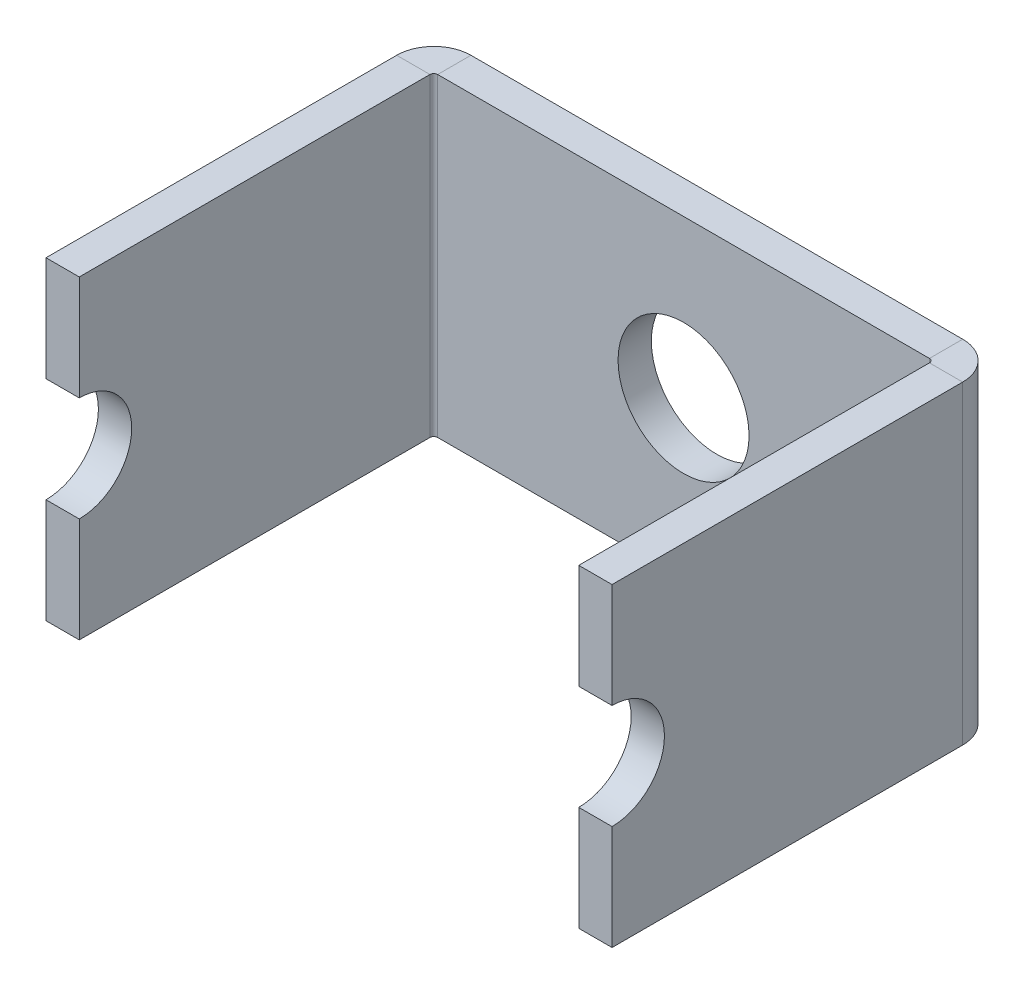
ISO-10303-21;
HEADER;
FILE_DESCRIPTION(('STEP AP214'),'2;1');
FILE_NAME('part.step','',(''),(''),'','','');
FILE_SCHEMA(('AUTOMOTIVE_DESIGN { 1 0 10303 214 1 1 1 1 }'));
ENDSEC;
DATA;
#1=APPLICATION_CONTEXT('core data for automotive mechanical design processes');
#2=APPLICATION_PROTOCOL_DEFINITION('international standard','automotive_design',2000,#1);
#3=PRODUCT_CONTEXT('',#1,'mechanical');
#4=PRODUCT('Part','Part','',(#3));
#5=PRODUCT_RELATED_PRODUCT_CATEGORY('part','',(#4));
#6=PRODUCT_DEFINITION_FORMATION('','',#4);
#7=PRODUCT_DEFINITION_CONTEXT('part definition',#1,'design');
#8=PRODUCT_DEFINITION('design','',#6,#7);
#9=PRODUCT_DEFINITION_SHAPE('','',#8);
#10=(LENGTH_UNIT() NAMED_UNIT(*) SI_UNIT(.MILLI.,.METRE.));
#11=(NAMED_UNIT(*) PLANE_ANGLE_UNIT() SI_UNIT($,.RADIAN.));
#12=(NAMED_UNIT(*) SI_UNIT($,.STERADIAN.) SOLID_ANGLE_UNIT());
#13=UNCERTAINTY_MEASURE_WITH_UNIT(LENGTH_MEASURE(1.E-05),#10,'distance_accuracy_value','');
#14=(GEOMETRIC_REPRESENTATION_CONTEXT(3) GLOBAL_UNCERTAINTY_ASSIGNED_CONTEXT((#13)) GLOBAL_UNIT_ASSIGNED_CONTEXT((#10,
#11,#12)) REPRESENTATION_CONTEXT('',''));
#15=CARTESIAN_POINT('',(0.,0.,0.));
#16=DIRECTION('',(0.,0.,1.));
#17=DIRECTION('',(1.,0.,0.));
#18=AXIS2_PLACEMENT_3D('',#15,#16,#17);
#19=CARTESIAN_POINT('',(65.9855634559457,0.,67.6644365440546));
#20=DIRECTION('',(0.,0.,1.));
#21=DIRECTION('',(0.,-1.,0.));
#22=AXIS2_PLACEMENT_3D('',#19,#20,#21);
#23=PLANE('',#22);
#24=DIRECTION('',(1.,0.,0.));
#25=VECTOR('',#24,1.);
#26=CARTESIAN_POINT('',(65.9855634559452,-40.,67.6644365440546));
#27=LINE('',#26,#25);
#28=CARTESIAN_POINT('',(65.9855634559452,-40.,67.6644365440546));
#29=VERTEX_POINT('',#28);
#30=CARTESIAN_POINT('',(72.3355634559457,-40.,67.6644365440545));
#31=VERTEX_POINT('',#30);
#32=EDGE_CURVE('E160',#29,#31,#27,.T.);
#33=ORIENTED_EDGE('',*,*,#32,.F.);
#34=DIRECTION('',(0.,-1.,0.));
#35=VECTOR('',#34,1.);
#36=CARTESIAN_POINT('',(65.9855634559457,0.,67.6644365440546));
#37=LINE('',#36,#35);
#38=CARTESIAN_POINT('',(65.9855634559457,-60.,67.6644365440546));
#39=VERTEX_POINT('',#38);
#40=EDGE_CURVE('E171',#29,#39,#37,.T.);
#41=ORIENTED_EDGE('',*,*,#40,.T.);
#42=DIRECTION('',(1.,0.,0.));
#43=VECTOR('',#42,1.);
#44=CARTESIAN_POINT('',(65.9855634559457,-60.,67.6644365440546));
#45=LINE('',#44,#43);
#46=CARTESIAN_POINT('',(72.3355634559457,-60.,67.6644365440545));
#47=VERTEX_POINT('',#46);
#48=EDGE_CURVE('E197',#39,#47,#45,.T.);
#49=ORIENTED_EDGE('',*,*,#48,.T.);
#50=DIRECTION('',(0.,-1.,0.));
#51=VECTOR('',#50,1.);
#52=CARTESIAN_POINT('',(72.3355634559457,0.,67.6644365440545));
#53=LINE('',#52,#51);
#54=EDGE_CURVE('E173',#31,#47,#53,.T.);
#55=ORIENTED_EDGE('',*,*,#54,.F.);
#56=EDGE_LOOP('',(#33,#41,#49,#55));
#57=FACE_BOUND('',#56,.T.);
#58=ADVANCED_FACE('F48',(#57),#23,.T.);
#59=CARTESIAN_POINT('',(174.014436544054,0.,67.6644365440546));
#60=DIRECTION('',(0.,0.,1.));
#61=DIRECTION('',(1.,0.,0.));
#62=AXIS2_PLACEMENT_3D('',#59,#60,#61);
#63=PLANE('',#62);
#64=DIRECTION('',(1.,0.,0.));
#65=VECTOR('',#64,1.);
#66=CARTESIAN_POINT('',(65.9855634559452,-40.,67.6644365440542));
#67=LINE('',#66,#65);
#68=CARTESIAN_POINT('',(167.664436544054,-40.,67.6644365440546));
#69=VERTEX_POINT('',#68);
#70=CARTESIAN_POINT('',(174.014436544054,-40.,67.6644365440546));
#71=VERTEX_POINT('',#70);
#72=EDGE_CURVE('E337',#69,#71,#67,.T.);
#73=ORIENTED_EDGE('',*,*,#72,.F.);
#74=DIRECTION('',(0.,1.,0.));
#75=VECTOR('',#74,1.);
#76=CARTESIAN_POINT('',(167.664436544054,0.,67.6644365440546));
#77=LINE('',#76,#75);
#78=CARTESIAN_POINT('',(167.664436544054,-60.,67.6644365440546));
#79=VERTEX_POINT('',#78);
#80=EDGE_CURVE('E302',#79,#69,#77,.T.);
#81=ORIENTED_EDGE('',*,*,#80,.F.);
#82=DIRECTION('',(-1.,0.,0.));
#83=VECTOR('',#82,1.);
#84=CARTESIAN_POINT('',(174.014436544054,-60.,67.6644365440546));
#85=LINE('',#84,#83);
#86=CARTESIAN_POINT('',(174.014436544054,-60.,67.6644365440546));
#87=VERTEX_POINT('',#86);
#88=EDGE_CURVE('E284',#87,#79,#85,.T.);
#89=ORIENTED_EDGE('',*,*,#88,.F.);
#90=DIRECTION('',(0.,1.,0.));
#91=VECTOR('',#90,1.);
#92=CARTESIAN_POINT('',(174.014436544054,0.,67.6644365440546));
#93=LINE('',#92,#91);
#94=EDGE_CURVE('E316',#87,#71,#93,.T.);
#95=ORIENTED_EDGE('',*,*,#94,.T.);
#96=EDGE_LOOP('',(#73,#81,#89,#95));
#97=FACE_BOUND('',#96,.T.);
#98=ADVANCED_FACE('F360',(#97),#63,.T.);
#99=CARTESIAN_POINT('',(0.,0.,-6.35));
#100=DIRECTION('',(0.,1.,0.));
#101=DIRECTION('',(0.,0.,1.));
#102=AXIS2_PLACEMENT_3D('',#99,#100,#101);
#103=PLANE('',#102);
#104=DIRECTION('',(-1.,0.,0.));
#105=VECTOR('',#104,1.);
#106=CARTESIAN_POINT('',(0.,0.,0.));
#107=LINE('',#106,#105);
#108=CARTESIAN_POINT('',(166.927836544055,0.,0.));
#109=VERTEX_POINT('',#108);
#110=CARTESIAN_POINT('',(73.0721634559455,0.,0.));
#111=VERTEX_POINT('',#110);
#112=EDGE_CURVE('E226',#109,#111,#107,.T.);
#113=ORIENTED_EDGE('',*,*,#112,.F.);
#114=DIRECTION('',(0.,0.,-1.));
#115=VECTOR('',#114,1.);
#116=CARTESIAN_POINT('',(166.927836544055,0.,-6.35));
#117=LINE('',#116,#115);
#118=CARTESIAN_POINT('',(166.927836544055,0.,-6.35));
#119=VERTEX_POINT('',#118);
#120=EDGE_CURVE('E215',#109,#119,#117,.T.);
#121=ORIENTED_EDGE('',*,*,#120,.T.);
#122=DIRECTION('',(-1.,0.,0.));
#123=VECTOR('',#122,1.);
#124=CARTESIAN_POINT('',(0.,0.,-6.35));
#125=LINE('',#124,#123);
#126=CARTESIAN_POINT('',(73.0721634559455,0.,-6.35000000000001));
#127=VERTEX_POINT('',#126);
#128=EDGE_CURVE('E230',#119,#127,#125,.T.);
#129=ORIENTED_EDGE('',*,*,#128,.T.);
#130=DIRECTION('',(0.,0.,-1.));
#131=VECTOR('',#130,1.);
#132=CARTESIAN_POINT('',(73.0721634559455,0.,-6.35));
#133=LINE('',#132,#131);
#134=EDGE_CURVE('E236',#111,#127,#133,.T.);
#135=ORIENTED_EDGE('',*,*,#134,.F.);
#136=EDGE_LOOP('',(#113,#121,#129,#135));
#137=FACE_BOUND('',#136,.T.);
#138=ADVANCED_FACE('F384',(#137),#103,.T.);
#139=CARTESIAN_POINT('',(0.,0.,0.));
#140=DIRECTION('',(0.,0.,1.));
#141=DIRECTION('',(1.,0.,0.));
#142=AXIS2_PLACEMENT_3D('',#139,#140,#141);
#143=PLANE('',#142);
#144=CARTESIAN_POINT('',(120.,-30.,0.));
#145=DIRECTION('',(0.,0.,1.));
#146=DIRECTION('',(1.,0.,0.));
#147=AXIS2_PLACEMENT_3D('',#144,#145,#146);
#148=CIRCLE('',#147,12.5);
#149=CARTESIAN_POINT('',(132.5,-30.,0.));
#150=VERTEX_POINT('',#149);
#151=EDGE_CURVE('E298',#150,#150,#148,.T.);
#152=ORIENTED_EDGE('',*,*,#151,.F.);
#153=EDGE_LOOP('',(#152));
#154=FACE_BOUND('',#153,.T.);
#155=DIRECTION('',(1.,0.,0.));
#156=VECTOR('',#155,1.);
#157=CARTESIAN_POINT('',(0.,-60.,0.));
#158=LINE('',#157,#156);
#159=CARTESIAN_POINT('',(73.0721634559455,-60.,0.));
#160=VERTEX_POINT('',#159);
#161=CARTESIAN_POINT('',(166.927836544055,-60.,0.));
#162=VERTEX_POINT('',#161);
#163=EDGE_CURVE('E228',#160,#162,#158,.T.);
#164=ORIENTED_EDGE('',*,*,#163,.T.);
#165=DIRECTION('',(0.,1.,0.));
#166=VECTOR('',#165,1.);
#167=CARTESIAN_POINT('',(166.927836544055,0.,0.));
#168=LINE('',#167,#166);
#169=EDGE_CURVE('E218',#162,#109,#168,.T.);
#170=ORIENTED_EDGE('',*,*,#169,.T.);
#171=ORIENTED_EDGE('',*,*,#112,.T.);
#172=DIRECTION('',(0.,1.,0.));
#173=VECTOR('',#172,1.);
#174=CARTESIAN_POINT('',(73.0721634559455,0.,0.));
#175=LINE('',#174,#173);
#176=EDGE_CURVE('E241',#160,#111,#175,.T.);
#177=ORIENTED_EDGE('',*,*,#176,.F.);
#178=EDGE_LOOP('',(#164,#170,#171,#177));
#179=FACE_BOUND('',#178,.T.);
#180=ADVANCED_FACE('F409',(#154,#179),#143,.T.);
#181=CARTESIAN_POINT('',(0.,-60.,-6.35));
#182=DIRECTION('',(0.,-1.,0.));
#183=DIRECTION('',(0.,0.,-1.));
#184=AXIS2_PLACEMENT_3D('',#181,#182,#183);
#185=PLANE('',#184);
#186=DIRECTION('',(1.,0.,0.));
#187=VECTOR('',#186,1.);
#188=CARTESIAN_POINT('',(0.,-60.,-6.35));
#189=LINE('',#188,#187);
#190=CARTESIAN_POINT('',(73.0721634559455,-60.,-6.35));
#191=VERTEX_POINT('',#190);
#192=CARTESIAN_POINT('',(166.927836544055,-60.,-6.35));
#193=VERTEX_POINT('',#192);
#194=EDGE_CURVE('E223',#191,#193,#189,.T.);
#195=ORIENTED_EDGE('',*,*,#194,.T.);
#196=DIRECTION('',(0.,0.,1.));
#197=VECTOR('',#196,1.);
#198=CARTESIAN_POINT('',(166.927836544055,-60.,-6.35));
#199=LINE('',#198,#197);
#200=EDGE_CURVE('E56',#193,#162,#199,.T.);
#201=ORIENTED_EDGE('',*,*,#200,.T.);
#202=ORIENTED_EDGE('',*,*,#163,.F.);
#203=DIRECTION('',(0.,0.,1.));
#204=VECTOR('',#203,1.);
#205=CARTESIAN_POINT('',(73.0721634559455,-60.,-6.35));
#206=LINE('',#205,#204);
#207=EDGE_CURVE('E188',#191,#160,#206,.T.);
#208=ORIENTED_EDGE('',*,*,#207,.F.);
#209=EDGE_LOOP('',(#195,#201,#202,#208));
#210=FACE_BOUND('',#209,.T.);
#211=ADVANCED_FACE('F50',(#210),#185,.T.);
#212=CARTESIAN_POINT('',(65.9855634559457,0.,67.6644365440546));
#213=DIRECTION('',(0.,1.,0.));
#214=DIRECTION('',(1.,0.,0.));
#215=AXIS2_PLACEMENT_3D('',#212,#213,#214);
#216=PLANE('',#215);
#217=DIRECTION('',(0.,0.,1.));
#218=VECTOR('',#217,1.);
#219=CARTESIAN_POINT('',(72.3355634559457,0.,67.6644365440545));
#220=LINE('',#219,#218);
#221=CARTESIAN_POINT('',(72.3355634559455,0.,0.73659999999999));
#222=VERTEX_POINT('',#221);
#223=CARTESIAN_POINT('',(72.3355634559457,0.,67.6644365440545));
#224=VERTEX_POINT('',#223);
#225=EDGE_CURVE('E182',#222,#224,#220,.T.);
#226=ORIENTED_EDGE('',*,*,#225,.F.);
#227=DIRECTION('',(-1.,0.,0.));
#228=VECTOR('',#227,1.);
#229=CARTESIAN_POINT('',(65.9855634559455,0.,0.736600000000018));
#230=LINE('',#229,#228);
#231=CARTESIAN_POINT('',(65.9855634559455,0.,0.736600000000024));
#232=VERTEX_POINT('',#231);
#233=EDGE_CURVE('E202',#222,#232,#230,.T.);
#234=ORIENTED_EDGE('',*,*,#233,.T.);
#235=DIRECTION('',(0.,0.,1.));
#236=VECTOR('',#235,1.);
#237=CARTESIAN_POINT('',(65.9855634559457,0.,67.6644365440546));
#238=LINE('',#237,#236);
#239=CARTESIAN_POINT('',(65.9855634559457,0.,67.6644365440546));
#240=VERTEX_POINT('',#239);
#241=EDGE_CURVE('E199',#232,#240,#238,.T.);
#242=ORIENTED_EDGE('',*,*,#241,.T.);
#243=DIRECTION('',(1.,0.,0.));
#244=VECTOR('',#243,1.);
#245=CARTESIAN_POINT('',(65.9855634559457,0.,67.6644365440546));
#246=LINE('',#245,#244);
#247=EDGE_CURVE('E193',#240,#224,#246,.T.);
#248=ORIENTED_EDGE('',*,*,#247,.T.);
#249=EDGE_LOOP('',(#226,#234,#242,#248));
#250=FACE_BOUND('',#249,.T.);
#251=ADVANCED_FACE('F403',(#250),#216,.T.);
#252=CARTESIAN_POINT('',(65.9855634559457,-60.,67.6644365440546));
#253=DIRECTION('',(0.,-1.,0.));
#254=DIRECTION('',(-1.,0.,0.));
#255=AXIS2_PLACEMENT_3D('',#252,#253,#254);
#256=PLANE('',#255);
#257=DIRECTION('',(0.,0.,-1.));
#258=VECTOR('',#257,1.);
#259=CARTESIAN_POINT('',(65.9855634559457,-60.,67.6644365440546));
#260=LINE('',#259,#258);
#261=CARTESIAN_POINT('',(65.9855634559455,-60.,0.736600000000032));
#262=VERTEX_POINT('',#261);
#263=EDGE_CURVE('E180',#39,#262,#260,.T.);
#264=ORIENTED_EDGE('',*,*,#263,.T.);
#265=DIRECTION('',(1.,0.,0.));
#266=VECTOR('',#265,1.);
#267=CARTESIAN_POINT('',(65.9855634559455,-60.,0.736600000000018));
#268=LINE('',#267,#266);
#269=CARTESIAN_POINT('',(72.3355634559455,-60.,0.73659999999999));
#270=VERTEX_POINT('',#269);
#271=EDGE_CURVE('E207',#262,#270,#268,.T.);
#272=ORIENTED_EDGE('',*,*,#271,.T.);
#273=DIRECTION('',(0.,0.,-1.));
#274=VECTOR('',#273,1.);
#275=CARTESIAN_POINT('',(72.3355634559457,-60.,67.6644365440545));
#276=LINE('',#275,#274);
#277=EDGE_CURVE('E184',#47,#270,#276,.T.);
#278=ORIENTED_EDGE('',*,*,#277,.F.);
#279=ORIENTED_EDGE('',*,*,#48,.F.);
#280=EDGE_LOOP('',(#264,#272,#278,#279));
#281=FACE_BOUND('',#280,.T.);
#282=ADVANCED_FACE('F396',(#281),#256,.T.);
#283=CARTESIAN_POINT('',(72.3355634559457,0.,67.6644365440545));
#284=DIRECTION('',(1.,0.,0.));
#285=DIRECTION('',(0.,0.,-1.));
#286=AXIS2_PLACEMENT_3D('',#283,#284,#285);
#287=PLANE('',#286);
#288=CARTESIAN_POINT('',(72.3355634559457,-30.,67.6644365440542));
#289=DIRECTION('',(1.,0.,0.));
#290=DIRECTION('',(0.,0.,-1.));
#291=AXIS2_PLACEMENT_3D('',#288,#289,#290);
#292=CIRCLE('',#291,10.);
#293=CARTESIAN_POINT('',(72.3355634559457,-20.,67.6644365440546));
#294=VERTEX_POINT('',#293);
#295=EDGE_CURVE('E175',#31,#294,#292,.T.);
#296=ORIENTED_EDGE('',*,*,#295,.F.);
#297=ORIENTED_EDGE('',*,*,#54,.T.);
#298=ORIENTED_EDGE('',*,*,#277,.T.);
#299=DIRECTION('',(0.,1.,0.));
#300=VECTOR('',#299,1.);
#301=CARTESIAN_POINT('',(72.3355634559455,0.,0.73659999999999));
#302=LINE('',#301,#300);
#303=EDGE_CURVE('E204',#270,#222,#302,.T.);
#304=ORIENTED_EDGE('',*,*,#303,.T.);
#305=ORIENTED_EDGE('',*,*,#225,.T.);
#306=EDGE_CURVE('E190',#224,#294,#53,.T.);
#307=ORIENTED_EDGE('',*,*,#306,.T.);
#308=EDGE_LOOP('',(#296,#297,#298,#304,#305,#307));
#309=FACE_BOUND('',#308,.T.);
#310=ADVANCED_FACE('F389',(#309),#287,.T.);
#311=DIRECTION('',(1.,0.,0.));
#312=VECTOR('',#311,1.);
#313=CARTESIAN_POINT('',(65.9855634559452,-20.,67.6644365440546));
#314=LINE('',#313,#312);
#315=CARTESIAN_POINT('',(65.9855634559457,-20.,67.6644365440546));
#316=VERTEX_POINT('',#315);
#317=EDGE_CURVE('E63',#294,#316,#314,.F.);
#318=ORIENTED_EDGE('',*,*,#317,.F.);
#319=ORIENTED_EDGE('',*,*,#306,.F.);
#320=ORIENTED_EDGE('',*,*,#247,.F.);
#321=EDGE_CURVE('E181',#240,#316,#37,.T.);
#322=ORIENTED_EDGE('',*,*,#321,.T.);
#323=EDGE_LOOP('',(#318,#319,#320,#322));
#324=FACE_BOUND('',#323,.T.);
#325=ADVANCED_FACE('F380',(#324),#23,.T.);
#326=CARTESIAN_POINT('',(65.9855634559457,0.,67.6644365440546));
#327=DIRECTION('',(1.,0.,0.));
#328=DIRECTION('',(0.,0.,-1.));
#329=AXIS2_PLACEMENT_3D('',#326,#327,#328);
#330=PLANE('',#329);
#331=ORIENTED_EDGE('',*,*,#40,.F.);
#332=CARTESIAN_POINT('',(65.9855634559452,-30.,67.6644365440542));
#333=DIRECTION('',(1.,0.,0.));
#334=DIRECTION('',(0.,0.,-1.));
#335=AXIS2_PLACEMENT_3D('',#332,#333,#334);
#336=CIRCLE('',#335,10.);
#337=EDGE_CURVE('E157',#29,#316,#336,.T.);
#338=ORIENTED_EDGE('',*,*,#337,.T.);
#339=ORIENTED_EDGE('',*,*,#321,.F.);
#340=ORIENTED_EDGE('',*,*,#241,.F.);
#341=DIRECTION('',(0.,1.,0.));
#342=VECTOR('',#341,1.);
#343=CARTESIAN_POINT('',(65.9855634559455,0.,0.736600000000018));
#344=LINE('',#343,#342);
#345=EDGE_CURVE('E196',#262,#232,#344,.T.);
#346=ORIENTED_EDGE('',*,*,#345,.F.);
#347=ORIENTED_EDGE('',*,*,#263,.F.);
#348=EDGE_LOOP('',(#331,#338,#339,#340,#346,#347));
#349=FACE_BOUND('',#348,.T.);
#350=ADVANCED_FACE('F178',(#349),#330,.F.);
#351=CARTESIAN_POINT('',(0.,0.,-6.35));
#352=DIRECTION('',(0.,0.,1.));
#353=DIRECTION('',(1.,0.,0.));
#354=AXIS2_PLACEMENT_3D('',#351,#352,#353);
#355=PLANE('',#354);
#356=CARTESIAN_POINT('',(120.,-30.,-6.35));
#357=DIRECTION('',(0.,0.,-1.));
#358=DIRECTION('',(-1.,0.,0.));
#359=AXIS2_PLACEMENT_3D('',#356,#357,#358);
#360=CIRCLE('',#359,12.5);
#361=CARTESIAN_POINT('',(107.5,-30.,-6.35));
#362=VERTEX_POINT('',#361);
#363=EDGE_CURVE('E174',#362,#362,#360,.T.);
#364=ORIENTED_EDGE('',*,*,#363,.F.);
#365=EDGE_LOOP('',(#364));
#366=FACE_BOUND('',#365,.T.);
#367=DIRECTION('',(0.,1.,0.));
#368=VECTOR('',#367,1.);
#369=CARTESIAN_POINT('',(166.927836544055,0.,-6.35));
#370=LINE('',#369,#368);
#371=EDGE_CURVE('E210',#193,#119,#370,.T.);
#372=ORIENTED_EDGE('',*,*,#371,.F.);
#373=ORIENTED_EDGE('',*,*,#194,.F.);
#374=DIRECTION('',(0.,1.,0.));
#375=VECTOR('',#374,1.);
#376=CARTESIAN_POINT('',(73.0721634559455,0.,-6.35));
#377=LINE('',#376,#375);
#378=EDGE_CURVE('E231',#191,#127,#377,.T.);
#379=ORIENTED_EDGE('',*,*,#378,.T.);
#380=ORIENTED_EDGE('',*,*,#128,.F.);
#381=EDGE_LOOP('',(#372,#373,#379,#380));
#382=FACE_BOUND('',#381,.T.);
#383=ADVANCED_FACE('F395',(#366,#382),#355,.F.);
#384=CARTESIAN_POINT('',(73.0721634559455,-60.,0.7366));
#385=DIRECTION('',(0.,-1.,0.));
#386=DIRECTION('',(0.,0.,-1.));
#387=AXIS2_PLACEMENT_3D('',#384,#385,#386);
#388=PLANE('',#387);
#389=ORIENTED_EDGE('',*,*,#207,.T.);
#390=CARTESIAN_POINT('',(73.0721634559455,-60.,0.7366));
#391=DIRECTION('',(0.,1.,0.));
#392=DIRECTION('',(-1.,0.,0.));
#393=AXIS2_PLACEMENT_3D('',#390,#391,#392);
#394=CIRCLE('',#393,0.7366);
#395=EDGE_CURVE('E244',#160,#270,#394,.T.);
#396=ORIENTED_EDGE('',*,*,#395,.T.);
#397=ORIENTED_EDGE('',*,*,#271,.F.);
#398=CARTESIAN_POINT('',(73.0721634559455,-60.,0.7366));
#399=DIRECTION('',(0.,1.,0.));
#400=DIRECTION('',(0.,0.,-1.));
#401=AXIS2_PLACEMENT_3D('',#398,#399,#400);
#402=CIRCLE('',#401,7.08660000000001);
#403=EDGE_CURVE('E258',#191,#262,#402,.T.);
#404=ORIENTED_EDGE('',*,*,#403,.F.);
#405=EDGE_LOOP('',(#389,#396,#397,#404));
#406=FACE_BOUND('',#405,.T.);
#407=ADVANCED_FACE('F412',(#406),#388,.T.);
#408=CARTESIAN_POINT('',(73.0721634559455,0.,0.7366));
#409=DIRECTION('',(0.,1.,0.));
#410=DIRECTION('',(-1.,0.,0.));
#411=AXIS2_PLACEMENT_3D('',#408,#409,#410);
#412=PLANE('',#411);
#413=ORIENTED_EDGE('',*,*,#233,.F.);
#414=CARTESIAN_POINT('',(73.0721634559455,0.,0.7366));
#415=DIRECTION('',(0.,1.,0.));
#416=DIRECTION('',(-1.,0.,0.));
#417=AXIS2_PLACEMENT_3D('',#414,#415,#416);
#418=CIRCLE('',#417,0.7366);
#419=EDGE_CURVE('E263',#222,#111,#418,.F.);
#420=ORIENTED_EDGE('',*,*,#419,.T.);
#421=ORIENTED_EDGE('',*,*,#134,.T.);
#422=CARTESIAN_POINT('',(73.0721634559455,0.,0.7366));
#423=DIRECTION('',(0.,-1.,0.));
#424=DIRECTION('',(-1.,0.,0.));
#425=AXIS2_PLACEMENT_3D('',#422,#423,#424);
#426=CIRCLE('',#425,7.08660000000001);
#427=EDGE_CURVE('E252',#232,#127,#426,.T.);
#428=ORIENTED_EDGE('',*,*,#427,.F.);
#429=EDGE_LOOP('',(#413,#420,#421,#428));
#430=FACE_BOUND('',#429,.T.);
#431=ADVANCED_FACE('F406',(#430),#412,.T.);
#432=CARTESIAN_POINT('',(73.0721634559455,-90.6471372218029,0.7366));
#433=DIRECTION('',(0.,1.,0.));
#434=DIRECTION('',(-1.,0.,0.));
#435=AXIS2_PLACEMENT_3D('',#432,#433,#434);
#436=CYLINDRICAL_SURFACE('',#435,7.0866);
#437=ORIENTED_EDGE('',*,*,#427,.T.);
#438=ORIENTED_EDGE('',*,*,#378,.F.);
#439=ORIENTED_EDGE('',*,*,#403,.T.);
#440=ORIENTED_EDGE('',*,*,#345,.T.);
#441=EDGE_LOOP('',(#437,#438,#439,#440));
#442=FACE_BOUND('',#441,.T.);
#443=ADVANCED_FACE('F405',(#442),#436,.T.);
#444=CARTESIAN_POINT('',(73.0721634559455,-90.6471372218029,0.7366));
#445=DIRECTION('',(0.,1.,0.));
#446=DIRECTION('',(-1.,0.,0.));
#447=AXIS2_PLACEMENT_3D('',#444,#445,#446);
#448=CYLINDRICAL_SURFACE('',#447,0.7366);
#449=ORIENTED_EDGE('',*,*,#419,.F.);
#450=ORIENTED_EDGE('',*,*,#303,.F.);
#451=ORIENTED_EDGE('',*,*,#395,.F.);
#452=ORIENTED_EDGE('',*,*,#176,.T.);
#453=EDGE_LOOP('',(#449,#450,#451,#452));
#454=FACE_BOUND('',#453,.T.);
#455=ADVANCED_FACE('F415',(#454),#448,.F.);
#456=CARTESIAN_POINT('',(166.927836544055,-60.,0.7366));
#457=DIRECTION('',(0.,-1.,0.));
#458=DIRECTION('',(0.,0.,-1.));
#459=AXIS2_PLACEMENT_3D('',#456,#457,#458);
#460=PLANE('',#459);
#461=DIRECTION('',(-1.,0.,0.));
#462=VECTOR('',#461,1.);
#463=CARTESIAN_POINT('',(174.014436544055,-60.,0.736600000000032));
#464=LINE('',#463,#462);
#465=CARTESIAN_POINT('',(174.014436544055,-60.,0.736600000000032));
#466=VERTEX_POINT('',#465);
#467=CARTESIAN_POINT('',(167.664436544055,-60.,0.736600000000004));
#468=VERTEX_POINT('',#467);
#469=EDGE_CURVE('E325',#466,#468,#464,.T.);
#470=ORIENTED_EDGE('',*,*,#469,.T.);
#471=CARTESIAN_POINT('',(166.927836544055,-60.,0.7366));
#472=DIRECTION('',(0.,-1.,0.));
#473=DIRECTION('',(0.,0.,-1.));
#474=AXIS2_PLACEMENT_3D('',#471,#472,#473);
#475=CIRCLE('',#474,0.7366);
#476=EDGE_CURVE('E283',#468,#162,#475,.F.);
#477=ORIENTED_EDGE('',*,*,#476,.T.);
#478=ORIENTED_EDGE('',*,*,#200,.F.);
#479=CARTESIAN_POINT('',(166.927836544055,-60.,0.7366));
#480=DIRECTION('',(0.,1.,0.));
#481=DIRECTION('',(0.,0.,-1.));
#482=AXIS2_PLACEMENT_3D('',#479,#480,#481);
#483=CIRCLE('',#482,7.0866);
#484=EDGE_CURVE('E272',#466,#193,#483,.T.);
#485=ORIENTED_EDGE('',*,*,#484,.F.);
#486=EDGE_LOOP('',(#470,#477,#478,#485));
#487=FACE_BOUND('',#486,.T.);
#488=ADVANCED_FACE('F362',(#487),#460,.T.);
#489=CARTESIAN_POINT('',(166.927836544055,0.,0.7366));
#490=DIRECTION('',(0.,1.,0.));
#491=DIRECTION('',(0.,0.,1.));
#492=AXIS2_PLACEMENT_3D('',#489,#490,#491);
#493=PLANE('',#492);
#494=ORIENTED_EDGE('',*,*,#120,.F.);
#495=CARTESIAN_POINT('',(166.927836544055,0.,0.7366));
#496=DIRECTION('',(0.,-1.,0.));
#497=DIRECTION('',(0.,0.,-1.));
#498=AXIS2_PLACEMENT_3D('',#495,#496,#497);
#499=CIRCLE('',#498,0.7366);
#500=CARTESIAN_POINT('',(167.664436544055,0.,0.736600000000004));
#501=VERTEX_POINT('',#500);
#502=EDGE_CURVE('E278',#109,#501,#499,.T.);
#503=ORIENTED_EDGE('',*,*,#502,.T.);
#504=DIRECTION('',(1.,0.,0.));
#505=VECTOR('',#504,1.);
#506=CARTESIAN_POINT('',(174.014436544055,0.,0.736600000000032));
#507=LINE('',#506,#505);
#508=CARTESIAN_POINT('',(174.014436544055,0.,0.736600000000024));
#509=VERTEX_POINT('',#508);
#510=EDGE_CURVE('E320',#501,#509,#507,.T.);
#511=ORIENTED_EDGE('',*,*,#510,.T.);
#512=CARTESIAN_POINT('',(166.927836544055,0.,0.7366));
#513=DIRECTION('',(0.,-1.,0.));
#514=DIRECTION('',(0.,0.,1.));
#515=AXIS2_PLACEMENT_3D('',#512,#513,#514);
#516=CIRCLE('',#515,7.0866);
#517=EDGE_CURVE('E269',#119,#509,#516,.T.);
#518=ORIENTED_EDGE('',*,*,#517,.F.);
#519=EDGE_LOOP('',(#494,#503,#511,#518));
#520=FACE_BOUND('',#519,.T.);
#521=ADVANCED_FACE('F367',(#520),#493,.T.);
#522=CARTESIAN_POINT('',(166.927836544055,30.6471372218029,0.7366));
#523=DIRECTION('',(0.,-1.,0.));
#524=DIRECTION('',(0.,0.,-1.));
#525=AXIS2_PLACEMENT_3D('',#522,#523,#524);
#526=CYLINDRICAL_SURFACE('',#525,7.0866);
#527=ORIENTED_EDGE('',*,*,#517,.T.);
#528=DIRECTION('',(0.,1.,0.));
#529=VECTOR('',#528,1.);
#530=CARTESIAN_POINT('',(174.014436544055,0.,0.736600000000032));
#531=LINE('',#530,#529);
#532=EDGE_CURVE('E310',#466,#509,#531,.T.);
#533=ORIENTED_EDGE('',*,*,#532,.F.);
#534=ORIENTED_EDGE('',*,*,#484,.T.);
#535=ORIENTED_EDGE('',*,*,#371,.T.);
#536=EDGE_LOOP('',(#527,#533,#534,#535));
#537=FACE_BOUND('',#536,.T.);
#538=ADVANCED_FACE('F364',(#537),#526,.T.);
#539=CARTESIAN_POINT('',(166.927836544055,30.6471372218029,0.7366));
#540=DIRECTION('',(0.,-1.,0.));
#541=DIRECTION('',(0.,0.,-1.));
#542=AXIS2_PLACEMENT_3D('',#539,#540,#541);
#543=CYLINDRICAL_SURFACE('',#542,0.7366);
#544=ORIENTED_EDGE('',*,*,#502,.F.);
#545=ORIENTED_EDGE('',*,*,#169,.F.);
#546=ORIENTED_EDGE('',*,*,#476,.F.);
#547=DIRECTION('',(0.,1.,0.));
#548=VECTOR('',#547,1.);
#549=CARTESIAN_POINT('',(167.664436544055,0.,0.736600000000004));
#550=LINE('',#549,#548);
#551=EDGE_CURVE('E323',#468,#501,#550,.T.);
#552=ORIENTED_EDGE('',*,*,#551,.T.);
#553=EDGE_LOOP('',(#544,#545,#546,#552));
#554=FACE_BOUND('',#553,.T.);
#555=ADVANCED_FACE('F366',(#554),#543,.F.);
#556=DIRECTION('',(1.,0.,0.));
#557=VECTOR('',#556,1.);
#558=CARTESIAN_POINT('',(65.9855634559452,-20.,67.6644365440542));
#559=LINE('',#558,#557);
#560=CARTESIAN_POINT('',(174.014436544054,-20.,67.6644365440546));
#561=VERTEX_POINT('',#560);
#562=CARTESIAN_POINT('',(167.664436544054,-20.,67.6644365440546));
#563=VERTEX_POINT('',#562);
#564=EDGE_CURVE('E70',#561,#563,#559,.F.);
#565=ORIENTED_EDGE('',*,*,#564,.F.);
#566=CARTESIAN_POINT('',(174.014436544054,0.,67.6644365440546));
#567=VERTEX_POINT('',#566);
#568=EDGE_CURVE('E319',#561,#567,#93,.T.);
#569=ORIENTED_EDGE('',*,*,#568,.T.);
#570=DIRECTION('',(-1.,0.,0.));
#571=VECTOR('',#570,1.);
#572=CARTESIAN_POINT('',(174.014436544054,0.,67.6644365440546));
#573=LINE('',#572,#571);
#574=CARTESIAN_POINT('',(167.664436544054,0.,67.6644365440546));
#575=VERTEX_POINT('',#574);
#576=EDGE_CURVE('E313',#567,#575,#573,.T.);
#577=ORIENTED_EDGE('',*,*,#576,.T.);
#578=EDGE_CURVE('E305',#563,#575,#77,.T.);
#579=ORIENTED_EDGE('',*,*,#578,.F.);
#580=EDGE_LOOP('',(#565,#569,#577,#579));
#581=FACE_BOUND('',#580,.T.);
#582=ADVANCED_FACE('F348',(#581),#63,.T.);
#583=CARTESIAN_POINT('',(174.014436544055,0.,-172.335563455945));
#584=DIRECTION('',(-1.,0.,0.));
#585=DIRECTION('',(0.,0.,1.));
#586=AXIS2_PLACEMENT_3D('',#583,#584,#585);
#587=PLANE('',#586);
#588=ORIENTED_EDGE('',*,*,#568,.F.);
#589=CARTESIAN_POINT('',(174.014436544054,-30.,67.6644365440546));
#590=DIRECTION('',(1.,0.,0.));
#591=DIRECTION('',(0.,0.,-1.));
#592=AXIS2_PLACEMENT_3D('',#589,#590,#591);
#593=CIRCLE('',#592,10.);
#594=EDGE_CURVE('E166',#71,#561,#593,.T.);
#595=ORIENTED_EDGE('',*,*,#594,.F.);
#596=ORIENTED_EDGE('',*,*,#94,.F.);
#597=DIRECTION('',(0.,0.,1.));
#598=VECTOR('',#597,1.);
#599=CARTESIAN_POINT('',(174.014436544055,-60.,-172.335563455945));
#600=LINE('',#599,#598);
#601=EDGE_CURVE('E290',#466,#87,#600,.T.);
#602=ORIENTED_EDGE('',*,*,#601,.F.);
#603=ORIENTED_EDGE('',*,*,#532,.T.);
#604=DIRECTION('',(0.,0.,-1.));
#605=VECTOR('',#604,1.);
#606=CARTESIAN_POINT('',(174.014436544055,0.,-172.335563455945));
#607=LINE('',#606,#605);
#608=EDGE_CURVE('E308',#567,#509,#607,.T.);
#609=ORIENTED_EDGE('',*,*,#608,.F.);
#610=EDGE_LOOP('',(#588,#595,#596,#602,#603,#609));
#611=FACE_BOUND('',#610,.T.);
#612=ADVANCED_FACE('F351',(#611),#587,.F.);
#613=CARTESIAN_POINT('',(174.014436544055,0.,-172.335563455945));
#614=DIRECTION('',(0.,1.,0.));
#615=DIRECTION('',(-1.,0.,0.));
#616=AXIS2_PLACEMENT_3D('',#613,#614,#615);
#617=PLANE('',#616);
#618=ORIENTED_EDGE('',*,*,#510,.F.);
#619=DIRECTION('',(0.,0.,-1.));
#620=VECTOR('',#619,1.);
#621=CARTESIAN_POINT('',(167.664436544055,0.,-172.335563455945));
#622=LINE('',#621,#620);
#623=EDGE_CURVE('E295',#575,#501,#622,.T.);
#624=ORIENTED_EDGE('',*,*,#623,.F.);
#625=ORIENTED_EDGE('',*,*,#576,.F.);
#626=ORIENTED_EDGE('',*,*,#608,.T.);
#627=EDGE_LOOP('',(#618,#624,#625,#626));
#628=FACE_BOUND('',#627,.T.);
#629=ADVANCED_FACE('F354',(#628),#617,.T.);
#630=CARTESIAN_POINT('',(167.664436544055,0.,-172.335563455945));
#631=DIRECTION('',(-1.,0.,0.));
#632=DIRECTION('',(0.,0.,1.));
#633=AXIS2_PLACEMENT_3D('',#630,#631,#632);
#634=PLANE('',#633);
#635=CARTESIAN_POINT('',(167.664436544054,-30.,67.6644365440546));
#636=DIRECTION('',(-1.,0.,0.));
#637=DIRECTION('',(0.,0.,1.));
#638=AXIS2_PLACEMENT_3D('',#635,#636,#637);
#639=CIRCLE('',#638,10.);
#640=EDGE_CURVE('E12',#563,#69,#639,.T.);
#641=ORIENTED_EDGE('',*,*,#640,.F.);
#642=ORIENTED_EDGE('',*,*,#578,.T.);
#643=ORIENTED_EDGE('',*,*,#623,.T.);
#644=ORIENTED_EDGE('',*,*,#551,.F.);
#645=DIRECTION('',(0.,0.,1.));
#646=VECTOR('',#645,1.);
#647=CARTESIAN_POINT('',(167.664436544055,-60.,-172.335563455945));
#648=LINE('',#647,#646);
#649=EDGE_CURVE('E306',#468,#79,#648,.T.);
#650=ORIENTED_EDGE('',*,*,#649,.T.);
#651=ORIENTED_EDGE('',*,*,#80,.T.);
#652=EDGE_LOOP('',(#641,#642,#643,#644,#650,#651));
#653=FACE_BOUND('',#652,.T.);
#654=ADVANCED_FACE('F358',(#653),#634,.T.);
#655=CARTESIAN_POINT('',(174.014436544055,-60.,-172.335563455945));
#656=DIRECTION('',(0.,-1.,0.));
#657=DIRECTION('',(1.,0.,0.));
#658=AXIS2_PLACEMENT_3D('',#655,#656,#657);
#659=PLANE('',#658);
#660=ORIENTED_EDGE('',*,*,#469,.F.);
#661=ORIENTED_EDGE('',*,*,#601,.T.);
#662=ORIENTED_EDGE('',*,*,#88,.T.);
#663=ORIENTED_EDGE('',*,*,#649,.F.);
#664=EDGE_LOOP('',(#660,#661,#662,#663));
#665=FACE_BOUND('',#664,.T.);
#666=ADVANCED_FACE('F361',(#665),#659,.T.);
#667=CARTESIAN_POINT('',(120.,-30.,0.65));
#668=DIRECTION('',(0.,0.,-1.));
#669=DIRECTION('',(-1.,0.,0.));
#670=AXIS2_PLACEMENT_3D('',#667,#668,#669);
#671=CYLINDRICAL_SURFACE('',#670,12.5);
#672=ORIENTED_EDGE('',*,*,#151,.T.);
#673=EDGE_LOOP('',(#672));
#674=FACE_BOUND('',#673,.T.);
#675=ORIENTED_EDGE('',*,*,#363,.T.);
#676=EDGE_LOOP('',(#675));
#677=FACE_BOUND('',#676,.T.);
#678=ADVANCED_FACE('F511',(#674,#677),#671,.F.);
#679=CARTESIAN_POINT('',(65.9855634559452,-30.,67.6644365440542));
#680=DIRECTION('',(1.,0.,0.));
#681=DIRECTION('',(0.,0.,-1.));
#682=AXIS2_PLACEMENT_3D('',#679,#680,#681);
#683=CYLINDRICAL_SURFACE('',#682,10.);
#684=ORIENTED_EDGE('',*,*,#72,.T.);
#685=ORIENTED_EDGE('',*,*,#594,.T.);
#686=ORIENTED_EDGE('',*,*,#564,.T.);
#687=ORIENTED_EDGE('',*,*,#640,.T.);
#688=EDGE_LOOP('',(#684,#685,#686,#687));
#689=FACE_BOUND('',#688,.T.);
#690=ADVANCED_FACE('F341',(#689),#683,.F.);
#691=ORIENTED_EDGE('',*,*,#32,.T.);
#692=ORIENTED_EDGE('',*,*,#295,.T.);
#693=ORIENTED_EDGE('',*,*,#317,.T.);
#694=ORIENTED_EDGE('',*,*,#337,.F.);
#695=EDGE_LOOP('',(#691,#692,#693,#694));
#696=FACE_BOUND('',#695,.T.);
#697=ADVANCED_FACE('F159',(#696),#683,.F.);
#698=CLOSED_SHELL('',(#58,#98,#138,#180,#211,#251,#282,#310,#325,#350,#383,#407,#431,#443,#455,
#488,#521,#538,#555,#582,#612,#629,#654,#666,#678,#690,#697));
#699=MANIFOLD_SOLID_BREP('B2',#698);
#700=ADVANCED_BREP_SHAPE_REPRESENTATION('',(#18,#699),#14);
#701=SHAPE_DEFINITION_REPRESENTATION(#9,#700);
ENDSEC;
END-ISO-10303-21;
